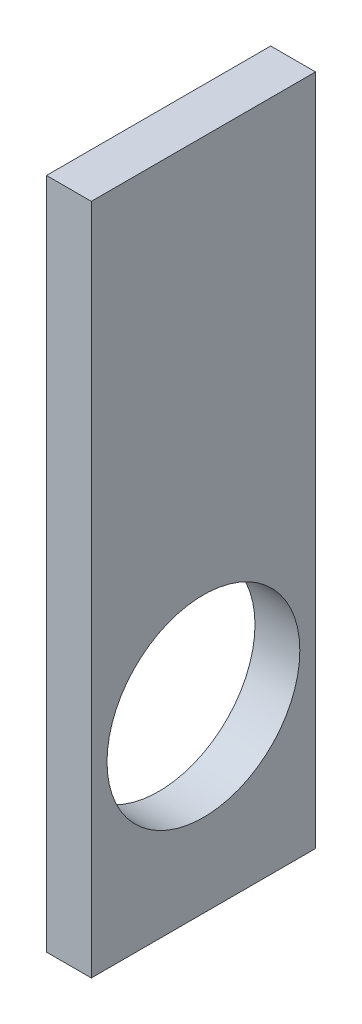
ISO-10303-21;
HEADER;
FILE_DESCRIPTION(('STEP AP214'),'2;1');
FILE_NAME('part.step','',(''),(''),'','','');
FILE_SCHEMA(('AUTOMOTIVE_DESIGN { 1 0 10303 214 1 1 1 1 }'));
ENDSEC;
DATA;
#1=APPLICATION_CONTEXT('core data for automotive mechanical design processes');
#2=APPLICATION_PROTOCOL_DEFINITION('international standard','automotive_design',2000,#1);
#3=PRODUCT_CONTEXT('',#1,'mechanical');
#4=PRODUCT('Part','Part','',(#3));
#5=PRODUCT_RELATED_PRODUCT_CATEGORY('part','',(#4));
#6=PRODUCT_DEFINITION_FORMATION('','',#4);
#7=PRODUCT_DEFINITION_CONTEXT('part definition',#1,'design');
#8=PRODUCT_DEFINITION('design','',#6,#7);
#9=PRODUCT_DEFINITION_SHAPE('','',#8);
#10=(LENGTH_UNIT() NAMED_UNIT(*) SI_UNIT(.MILLI.,.METRE.));
#11=(NAMED_UNIT(*) PLANE_ANGLE_UNIT() SI_UNIT($,.RADIAN.));
#12=(NAMED_UNIT(*) SI_UNIT($,.STERADIAN.) SOLID_ANGLE_UNIT());
#13=UNCERTAINTY_MEASURE_WITH_UNIT(LENGTH_MEASURE(1.E-05),#10,'distance_accuracy_value','');
#14=(GEOMETRIC_REPRESENTATION_CONTEXT(3) GLOBAL_UNCERTAINTY_ASSIGNED_CONTEXT((#13)) GLOBAL_UNIT_ASSIGNED_CONTEXT((#10,
#11,#12)) REPRESENTATION_CONTEXT('',''));
#15=CARTESIAN_POINT('',(0.,0.,0.));
#16=DIRECTION('',(0.,0.,1.));
#17=DIRECTION('',(1.,0.,0.));
#18=AXIS2_PLACEMENT_3D('',#15,#16,#17);
#19=CARTESIAN_POINT('',(4.99999999999999,150.,-25.));
#20=DIRECTION('',(-1.,0.,0.));
#21=DIRECTION('',(0.,0.,1.));
#22=AXIS2_PLACEMENT_3D('',#19,#20,#21);
#23=PLANE('',#22);
#24=CARTESIAN_POINT('',(5.,40.,0.));
#25=DIRECTION('',(1.,0.,0.));
#26=DIRECTION('',(0.,0.,-1.));
#27=AXIS2_PLACEMENT_3D('',#24,#25,#26);
#28=CIRCLE('',#27,21.5);
#29=CARTESIAN_POINT('',(4.99999999999999,40.,-21.5));
#30=VERTEX_POINT('',#29);
#31=EDGE_CURVE('E112',#30,#30,#28,.T.);
#32=ORIENTED_EDGE('',*,*,#31,.F.);
#33=EDGE_LOOP('',(#32));
#34=FACE_BOUND('',#33,.T.);
#35=DIRECTION('',(0.,0.,-1.));
#36=VECTOR('',#35,1.);
#37=CARTESIAN_POINT('',(4.99999999999999,0.,-25.));
#38=LINE('',#37,#36);
#39=CARTESIAN_POINT('',(5.,0.,25.));
#40=VERTEX_POINT('',#39);
#41=CARTESIAN_POINT('',(4.99999999999999,0.,-25.));
#42=VERTEX_POINT('',#41);
#43=EDGE_CURVE('E99',#40,#42,#38,.T.);
#44=ORIENTED_EDGE('',*,*,#43,.T.);
#45=DIRECTION('',(0.,-1.,0.));
#46=VECTOR('',#45,1.);
#47=CARTESIAN_POINT('',(4.99999999999999,150.,-25.));
#48=LINE('',#47,#46);
#49=CARTESIAN_POINT('',(4.99999999999999,150.,-25.));
#50=VERTEX_POINT('',#49);
#51=EDGE_CURVE('E11',#50,#42,#48,.T.);
#52=ORIENTED_EDGE('',*,*,#51,.F.);
#53=DIRECTION('',(0.,0.,-1.));
#54=VECTOR('',#53,1.);
#55=CARTESIAN_POINT('',(4.99999999999999,150.,-25.));
#56=LINE('',#55,#54);
#57=CARTESIAN_POINT('',(5.,150.,25.));
#58=VERTEX_POINT('',#57);
#59=EDGE_CURVE('E86',#58,#50,#56,.T.);
#60=ORIENTED_EDGE('',*,*,#59,.F.);
#61=DIRECTION('',(0.,-1.,0.));
#62=VECTOR('',#61,1.);
#63=CARTESIAN_POINT('',(5.,150.,25.));
#64=LINE('',#63,#62);
#65=EDGE_CURVE('E95',#58,#40,#64,.T.);
#66=ORIENTED_EDGE('',*,*,#65,.T.);
#67=EDGE_LOOP('',(#44,#52,#60,#66));
#68=FACE_BOUND('',#67,.T.);
#69=ADVANCED_FACE('F34',(#34,#68),#23,.F.);
#70=CARTESIAN_POINT('',(-5.00000000000001,150.,-25.));
#71=DIRECTION('',(0.,0.,1.));
#72=DIRECTION('',(1.,0.,0.));
#73=AXIS2_PLACEMENT_3D('',#70,#71,#72);
#74=PLANE('',#73);
#75=DIRECTION('',(-1.,0.,0.));
#76=VECTOR('',#75,1.);
#77=CARTESIAN_POINT('',(-5.00000000000001,0.,-25.));
#78=LINE('',#77,#76);
#79=CARTESIAN_POINT('',(-5.00000000000001,0.,-25.));
#80=VERTEX_POINT('',#79);
#81=EDGE_CURVE('E90',#42,#80,#78,.T.);
#82=ORIENTED_EDGE('',*,*,#81,.T.);
#83=DIRECTION('',(0.,-1.,0.));
#84=VECTOR('',#83,1.);
#85=CARTESIAN_POINT('',(-5.00000000000001,150.,-25.));
#86=LINE('',#85,#84);
#87=CARTESIAN_POINT('',(-5.00000000000001,150.,-25.));
#88=VERTEX_POINT('',#87);
#89=EDGE_CURVE('E43',#88,#80,#86,.T.);
#90=ORIENTED_EDGE('',*,*,#89,.F.);
#91=DIRECTION('',(-1.,0.,0.));
#92=VECTOR('',#91,1.);
#93=CARTESIAN_POINT('',(-5.00000000000001,150.,-25.));
#94=LINE('',#93,#92);
#95=EDGE_CURVE('E81',#50,#88,#94,.T.);
#96=ORIENTED_EDGE('',*,*,#95,.F.);
#97=ORIENTED_EDGE('',*,*,#51,.T.);
#98=EDGE_LOOP('',(#82,#90,#96,#97));
#99=FACE_BOUND('',#98,.T.);
#100=ADVANCED_FACE('F89',(#99),#74,.F.);
#101=CARTESIAN_POINT('',(-5.00000000000001,150.,-25.));
#102=DIRECTION('',(1.,0.,0.));
#103=DIRECTION('',(0.,0.,-1.));
#104=AXIS2_PLACEMENT_3D('',#101,#102,#103);
#105=PLANE('',#104);
#106=CARTESIAN_POINT('',(-5.,40.,0.));
#107=DIRECTION('',(1.,0.,0.));
#108=DIRECTION('',(0.,0.,-1.));
#109=AXIS2_PLACEMENT_3D('',#106,#107,#108);
#110=CIRCLE('',#109,21.5);
#111=CARTESIAN_POINT('',(-5.00000000000001,40.,-21.5));
#112=VERTEX_POINT('',#111);
#113=EDGE_CURVE('E37',#112,#112,#110,.T.);
#114=ORIENTED_EDGE('',*,*,#113,.T.);
#115=EDGE_LOOP('',(#114));
#116=FACE_BOUND('',#115,.T.);
#117=DIRECTION('',(0.,0.,1.));
#118=VECTOR('',#117,1.);
#119=CARTESIAN_POINT('',(-5.00000000000001,0.,-25.));
#120=LINE('',#119,#118);
#121=CARTESIAN_POINT('',(-5.,0.,25.));
#122=VERTEX_POINT('',#121);
#123=EDGE_CURVE('E68',#80,#122,#120,.T.);
#124=ORIENTED_EDGE('',*,*,#123,.T.);
#125=DIRECTION('',(0.,-1.,0.));
#126=VECTOR('',#125,1.);
#127=CARTESIAN_POINT('',(-5.,150.,25.));
#128=LINE('',#127,#126);
#129=CARTESIAN_POINT('',(-5.,150.,25.));
#130=VERTEX_POINT('',#129);
#131=EDGE_CURVE('E91',#130,#122,#128,.T.);
#132=ORIENTED_EDGE('',*,*,#131,.F.);
#133=DIRECTION('',(0.,0.,1.));
#134=VECTOR('',#133,1.);
#135=CARTESIAN_POINT('',(-5.00000000000001,150.,-25.));
#136=LINE('',#135,#134);
#137=EDGE_CURVE('E84',#88,#130,#136,.T.);
#138=ORIENTED_EDGE('',*,*,#137,.F.);
#139=ORIENTED_EDGE('',*,*,#89,.T.);
#140=EDGE_LOOP('',(#124,#132,#138,#139));
#141=FACE_BOUND('',#140,.T.);
#142=ADVANCED_FACE('F93',(#116,#141),#105,.F.);
#143=CARTESIAN_POINT('',(-5.,150.,25.));
#144=DIRECTION('',(0.,0.,-1.));
#145=DIRECTION('',(-1.,0.,0.));
#146=AXIS2_PLACEMENT_3D('',#143,#144,#145);
#147=PLANE('',#146);
#148=DIRECTION('',(1.,0.,0.));
#149=VECTOR('',#148,1.);
#150=CARTESIAN_POINT('',(-5.,0.,25.));
#151=LINE('',#150,#149);
#152=EDGE_CURVE('E74',#122,#40,#151,.T.);
#153=ORIENTED_EDGE('',*,*,#152,.T.);
#154=ORIENTED_EDGE('',*,*,#65,.F.);
#155=DIRECTION('',(1.,0.,0.));
#156=VECTOR('',#155,1.);
#157=CARTESIAN_POINT('',(-5.,150.,25.));
#158=LINE('',#157,#156);
#159=EDGE_CURVE('E51',#130,#58,#158,.T.);
#160=ORIENTED_EDGE('',*,*,#159,.F.);
#161=ORIENTED_EDGE('',*,*,#131,.T.);
#162=EDGE_LOOP('',(#153,#154,#160,#161));
#163=FACE_BOUND('',#162,.T.);
#164=ADVANCED_FACE('F106',(#163),#147,.F.);
#165=CARTESIAN_POINT('',(0.,150.,0.));
#166=DIRECTION('',(0.,1.,0.));
#167=DIRECTION('',(0.,0.,1.));
#168=AXIS2_PLACEMENT_3D('',#165,#166,#167);
#169=PLANE('',#168);
#170=ORIENTED_EDGE('',*,*,#59,.T.);
#171=ORIENTED_EDGE('',*,*,#95,.T.);
#172=ORIENTED_EDGE('',*,*,#137,.T.);
#173=ORIENTED_EDGE('',*,*,#159,.T.);
#174=EDGE_LOOP('',(#170,#171,#172,#173));
#175=FACE_BOUND('',#174,.T.);
#176=ADVANCED_FACE('F82',(#175),#169,.T.);
#177=CARTESIAN_POINT('',(0.,0.,0.));
#178=DIRECTION('',(0.,1.,0.));
#179=DIRECTION('',(0.,0.,1.));
#180=AXIS2_PLACEMENT_3D('',#177,#178,#179);
#181=PLANE('',#180);
#182=ORIENTED_EDGE('',*,*,#43,.F.);
#183=ORIENTED_EDGE('',*,*,#152,.F.);
#184=ORIENTED_EDGE('',*,*,#123,.F.);
#185=ORIENTED_EDGE('',*,*,#81,.F.);
#186=EDGE_LOOP('',(#182,#183,#184,#185));
#187=FACE_BOUND('',#186,.T.);
#188=ADVANCED_FACE('F109',(#187),#181,.F.);
#189=CARTESIAN_POINT('',(-145.,40.,0.));
#190=DIRECTION('',(1.,0.,0.));
#191=DIRECTION('',(0.,0.,-1.));
#192=AXIS2_PLACEMENT_3D('',#189,#190,#191);
#193=CYLINDRICAL_SURFACE('',#192,21.5);
#194=ORIENTED_EDGE('',*,*,#31,.T.);
#195=EDGE_LOOP('',(#194));
#196=FACE_BOUND('',#195,.T.);
#197=ORIENTED_EDGE('',*,*,#113,.F.);
#198=EDGE_LOOP('',(#197));
#199=FACE_BOUND('',#198,.T.);
#200=ADVANCED_FACE('F120',(#196,#199),#193,.F.);
#201=CLOSED_SHELL('',(#69,#100,#142,#164,#176,#188,#200));
#202=MANIFOLD_SOLID_BREP('B2',#201);
#203=ADVANCED_BREP_SHAPE_REPRESENTATION('',(#18,#202),#14);
#204=SHAPE_DEFINITION_REPRESENTATION(#9,#203);
ENDSEC;
END-ISO-10303-21;
